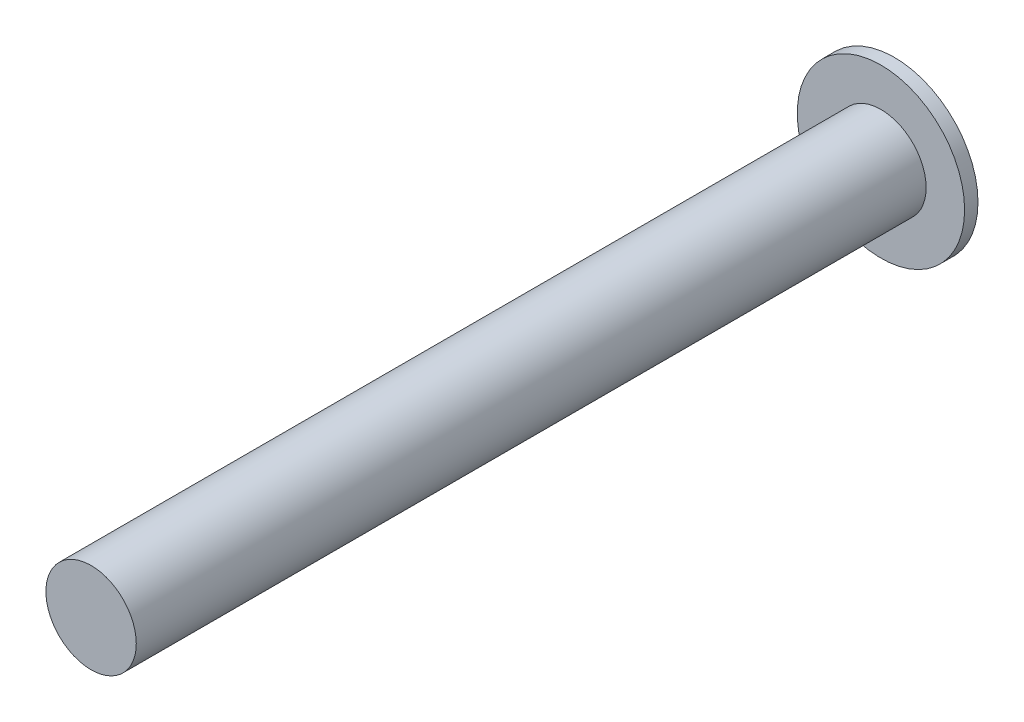
ISO-10303-21;
HEADER;
FILE_DESCRIPTION(('STEP AP214'),'2;1');
FILE_NAME('part.step','',(''),(''),'','','');
FILE_SCHEMA(('AUTOMOTIVE_DESIGN { 1 0 10303 214 1 1 1 1 }'));
ENDSEC;
DATA;
#1=APPLICATION_CONTEXT('core data for automotive mechanical design processes');
#2=APPLICATION_PROTOCOL_DEFINITION('international standard','automotive_design',2000,#1);
#3=PRODUCT_CONTEXT('',#1,'mechanical');
#4=PRODUCT('Part','Part','',(#3));
#5=PRODUCT_RELATED_PRODUCT_CATEGORY('part','',(#4));
#6=PRODUCT_DEFINITION_FORMATION('','',#4);
#7=PRODUCT_DEFINITION_CONTEXT('part definition',#1,'design');
#8=PRODUCT_DEFINITION('design','',#6,#7);
#9=PRODUCT_DEFINITION_SHAPE('','',#8);
#10=(LENGTH_UNIT() NAMED_UNIT(*) SI_UNIT(.MILLI.,.METRE.));
#11=(NAMED_UNIT(*) PLANE_ANGLE_UNIT() SI_UNIT($,.RADIAN.));
#12=(NAMED_UNIT(*) SI_UNIT($,.STERADIAN.) SOLID_ANGLE_UNIT());
#13=UNCERTAINTY_MEASURE_WITH_UNIT(LENGTH_MEASURE(1.E-05),#10,'distance_accuracy_value','');
#14=(GEOMETRIC_REPRESENTATION_CONTEXT(3) GLOBAL_UNCERTAINTY_ASSIGNED_CONTEXT((#13)) GLOBAL_UNIT_ASSIGNED_CONTEXT((#10,
#11,#12)) REPRESENTATION_CONTEXT('',''));
#15=CARTESIAN_POINT('',(0.,0.,0.));
#16=DIRECTION('',(0.,0.,1.));
#17=DIRECTION('',(1.,0.,0.));
#18=AXIS2_PLACEMENT_3D('',#15,#16,#17);
#19=CARTESIAN_POINT('',(0.,0.,2.));
#20=DIRECTION('',(0.,0.,-1.));
#21=DIRECTION('',(-1.,0.,0.));
#22=AXIS2_PLACEMENT_3D('',#19,#20,#21);
#23=CYLINDRICAL_SURFACE('',#22,12.5);
#24=CARTESIAN_POINT('',(0.,0.,2.));
#25=DIRECTION('',(0.,0.,1.));
#26=DIRECTION('',(1.,0.,0.));
#27=AXIS2_PLACEMENT_3D('',#24,#25,#26);
#28=CIRCLE('',#27,12.5);
#29=CARTESIAN_POINT('',(12.5,0.,2.));
#30=VERTEX_POINT('',#29);
#31=EDGE_CURVE('E77',#30,#30,#28,.T.);
#32=ORIENTED_EDGE('',*,*,#31,.F.);
#33=EDGE_LOOP('',(#32));
#34=FACE_BOUND('',#33,.T.);
#35=CARTESIAN_POINT('',(0.,0.,0.));
#36=DIRECTION('',(0.,0.,1.));
#37=DIRECTION('',(1.,0.,0.));
#38=AXIS2_PLACEMENT_3D('',#35,#36,#37);
#39=CIRCLE('',#38,12.5);
#40=CARTESIAN_POINT('',(12.5,0.,0.));
#41=VERTEX_POINT('',#40);
#42=EDGE_CURVE('E92',#41,#41,#39,.T.);
#43=ORIENTED_EDGE('',*,*,#42,.T.);
#44=EDGE_LOOP('',(#43));
#45=FACE_BOUND('',#44,.T.);
#46=ADVANCED_FACE('F35',(#34,#45),#23,.T.);
#47=CARTESIAN_POINT('',(0.,0.,2.));
#48=DIRECTION('',(0.,0.,1.));
#49=DIRECTION('',(1.,0.,0.));
#50=AXIS2_PLACEMENT_3D('',#47,#48,#49);
#51=PLANE('',#50);
#52=CARTESIAN_POINT('',(0.,0.,2.));
#53=DIRECTION('',(0.,0.,1.));
#54=DIRECTION('',(1.,0.,0.));
#55=AXIS2_PLACEMENT_3D('',#52,#53,#54);
#56=CIRCLE('',#55,6.75);
#57=CARTESIAN_POINT('',(6.75,0.,2.));
#58=VERTEX_POINT('',#57);
#59=EDGE_CURVE('E95',#58,#58,#56,.T.);
#60=ORIENTED_EDGE('',*,*,#59,.F.);
#61=EDGE_LOOP('',(#60));
#62=FACE_BOUND('',#61,.T.);
#63=ORIENTED_EDGE('',*,*,#31,.T.);
#64=EDGE_LOOP('',(#63));
#65=FACE_BOUND('',#64,.T.);
#66=ADVANCED_FACE('F140',(#62,#65),#51,.T.);
#67=CARTESIAN_POINT('',(0.,0.,0.));
#68=DIRECTION('',(0.,0.,1.));
#69=DIRECTION('',(1.,0.,0.));
#70=AXIS2_PLACEMENT_3D('',#67,#68,#69);
#71=PLANE('',#70);
#72=CARTESIAN_POINT('',(0.,0.,0.));
#73=DIRECTION('',(0.,0.,1.));
#74=DIRECTION('',(1.,0.,0.));
#75=AXIS2_PLACEMENT_3D('',#72,#73,#74);
#76=CIRCLE('',#75,5.75);
#77=CARTESIAN_POINT('',(5.75,0.,0.));
#78=VERTEX_POINT('',#77);
#79=EDGE_CURVE('E104',#78,#78,#76,.T.);
#80=ORIENTED_EDGE('',*,*,#79,.T.);
#81=EDGE_LOOP('',(#80));
#82=FACE_BOUND('',#81,.T.);
#83=ORIENTED_EDGE('',*,*,#42,.F.);
#84=EDGE_LOOP('',(#83));
#85=FACE_BOUND('',#84,.T.);
#86=ADVANCED_FACE('F145',(#82,#85),#71,.F.);
#87=CARTESIAN_POINT('',(0.,0.,120.));
#88=DIRECTION('',(0.,0.,-1.));
#89=DIRECTION('',(-1.,0.,0.));
#90=AXIS2_PLACEMENT_3D('',#87,#88,#89);
#91=CYLINDRICAL_SURFACE('',#90,6.75);
#92=DIRECTION('',(0.,0.,-1.));
#93=VECTOR('',#92,1.);
#94=CARTESIAN_POINT('',(-2.75,-6.16441400296898,120.));
#95=LINE('',#94,#93);
#96=CARTESIAN_POINT('',(-2.75,-6.16441400296898,90.));
#97=VERTEX_POINT('',#96);
#98=CARTESIAN_POINT('',(-2.75,-6.16441400296898,9.99999999999999));
#99=VERTEX_POINT('',#98);
#100=EDGE_CURVE('E84',#97,#99,#95,.T.);
#101=ORIENTED_EDGE('',*,*,#100,.F.);
#102=CARTESIAN_POINT('',(0.,0.,90.));
#103=DIRECTION('',(0.,0.,1.));
#104=DIRECTION('',(1.,0.,0.));
#105=AXIS2_PLACEMENT_3D('',#102,#103,#104);
#106=CIRCLE('',#105,6.75);
#107=CARTESIAN_POINT('',(2.75,-6.16441400296898,90.));
#108=VERTEX_POINT('',#107);
#109=EDGE_CURVE('E112',#97,#108,#106,.T.);
#110=ORIENTED_EDGE('',*,*,#109,.T.);
#111=DIRECTION('',(0.,0.,-1.));
#112=VECTOR('',#111,1.);
#113=CARTESIAN_POINT('',(2.75,-6.16441400296898,120.));
#114=LINE('',#113,#112);
#115=CARTESIAN_POINT('',(2.75,-6.16441400296898,9.99999999999999));
#116=VERTEX_POINT('',#115);
#117=EDGE_CURVE('E110',#116,#108,#114,.F.);
#118=ORIENTED_EDGE('',*,*,#117,.F.);
#119=CARTESIAN_POINT('',(0.,0.,9.99999999999999));
#120=DIRECTION('',(0.,0.,1.));
#121=DIRECTION('',(1.,0.,0.));
#122=AXIS2_PLACEMENT_3D('',#119,#120,#121);
#123=CIRCLE('',#122,6.75);
#124=EDGE_CURVE('E115',#99,#116,#123,.T.);
#125=ORIENTED_EDGE('',*,*,#124,.F.);
#126=EDGE_LOOP('',(#101,#110,#118,#125));
#127=FACE_BOUND('',#126,.T.);
#128=ORIENTED_EDGE('',*,*,#59,.T.);
#129=EDGE_LOOP('',(#128));
#130=FACE_BOUND('',#129,.T.);
#131=CARTESIAN_POINT('',(0.,0.,120.));
#132=DIRECTION('',(0.,0.,1.));
#133=DIRECTION('',(1.,0.,0.));
#134=AXIS2_PLACEMENT_3D('',#131,#132,#133);
#135=CIRCLE('',#134,6.75);
#136=CARTESIAN_POINT('',(6.75,0.,120.));
#137=VERTEX_POINT('',#136);
#138=EDGE_CURVE('E96',#137,#137,#135,.T.);
#139=ORIENTED_EDGE('',*,*,#138,.F.);
#140=EDGE_LOOP('',(#139));
#141=FACE_BOUND('',#140,.T.);
#142=ADVANCED_FACE('F124',(#127,#130,#141),#91,.T.);
#143=CARTESIAN_POINT('',(0.,0.,120.));
#144=DIRECTION('',(0.,0.,1.));
#145=DIRECTION('',(1.,0.,0.));
#146=AXIS2_PLACEMENT_3D('',#143,#144,#145);
#147=PLANE('',#146);
#148=ORIENTED_EDGE('',*,*,#138,.T.);
#149=EDGE_LOOP('',(#148));
#150=FACE_BOUND('',#149,.T.);
#151=ADVANCED_FACE('F157',(#150),#147,.T.);
#152=CARTESIAN_POINT('',(0.,0.,115.));
#153=DIRECTION('',(0.,0.,-1.));
#154=DIRECTION('',(-1.,0.,0.));
#155=AXIS2_PLACEMENT_3D('',#152,#153,#154);
#156=CYLINDRICAL_SURFACE('',#155,5.75);
#157=CARTESIAN_POINT('',(0.,0.,90.));
#158=DIRECTION('',(0.,0.,1.));
#159=DIRECTION('',(1.,0.,0.));
#160=AXIS2_PLACEMENT_3D('',#157,#158,#159);
#161=CIRCLE('',#160,5.75);
#162=CARTESIAN_POINT('',(-2.75,-5.04975246918104,90.));
#163=VERTEX_POINT('',#162);
#164=CARTESIAN_POINT('',(2.75,-5.04975246918104,90.));
#165=VERTEX_POINT('',#164);
#166=EDGE_CURVE('E11',#163,#165,#161,.T.);
#167=ORIENTED_EDGE('',*,*,#166,.F.);
#168=DIRECTION('',(0.,0.,-1.));
#169=VECTOR('',#168,1.);
#170=CARTESIAN_POINT('',(-2.75,-5.04975246918104,115.));
#171=LINE('',#170,#169);
#172=CARTESIAN_POINT('',(-2.75,-5.04975246918104,9.99999999999999));
#173=VERTEX_POINT('',#172);
#174=EDGE_CURVE('E42',#163,#173,#171,.T.);
#175=ORIENTED_EDGE('',*,*,#174,.T.);
#176=CARTESIAN_POINT('',(0.,0.,9.99999999999999));
#177=DIRECTION('',(0.,0.,1.));
#178=DIRECTION('',(1.,0.,0.));
#179=AXIS2_PLACEMENT_3D('',#176,#177,#178);
#180=CIRCLE('',#179,5.75);
#181=CARTESIAN_POINT('',(2.75,-5.04975246918104,9.99999999999999));
#182=VERTEX_POINT('',#181);
#183=EDGE_CURVE('E71',#173,#182,#180,.T.);
#184=ORIENTED_EDGE('',*,*,#183,.T.);
#185=DIRECTION('',(0.,0.,-1.));
#186=VECTOR('',#185,1.);
#187=CARTESIAN_POINT('',(2.75,-5.04975246918104,115.));
#188=LINE('',#187,#186);
#189=EDGE_CURVE('E76',#182,#165,#188,.F.);
#190=ORIENTED_EDGE('',*,*,#189,.T.);
#191=EDGE_LOOP('',(#167,#175,#184,#190));
#192=FACE_BOUND('',#191,.T.);
#193=CARTESIAN_POINT('',(0.,0.,115.));
#194=DIRECTION('',(0.,0.,1.));
#195=DIRECTION('',(1.,0.,0.));
#196=AXIS2_PLACEMENT_3D('',#193,#194,#195);
#197=CIRCLE('',#196,5.75);
#198=CARTESIAN_POINT('',(5.75,0.,115.));
#199=VERTEX_POINT('',#198);
#200=EDGE_CURVE('E103',#199,#199,#197,.T.);
#201=ORIENTED_EDGE('',*,*,#200,.T.);
#202=EDGE_LOOP('',(#201));
#203=FACE_BOUND('',#202,.T.);
#204=ORIENTED_EDGE('',*,*,#79,.F.);
#205=EDGE_LOOP('',(#204));
#206=FACE_BOUND('',#205,.T.);
#207=ADVANCED_FACE('F88',(#192,#203,#206),#156,.F.);
#208=CARTESIAN_POINT('',(0.,0.,115.));
#209=DIRECTION('',(0.,0.,1.));
#210=DIRECTION('',(1.,0.,0.));
#211=AXIS2_PLACEMENT_3D('',#208,#209,#210);
#212=PLANE('',#211);
#213=ORIENTED_EDGE('',*,*,#200,.F.);
#214=EDGE_LOOP('',(#213));
#215=FACE_BOUND('',#214,.T.);
#216=ADVANCED_FACE('F165',(#215),#212,.F.);
#217=CARTESIAN_POINT('',(-2.75,-9.51628895519298,90.));
#218=DIRECTION('',(1.,0.,0.));
#219=DIRECTION('',(0.,0.,-1.));
#220=AXIS2_PLACEMENT_3D('',#217,#218,#219);
#221=PLANE('',#220);
#222=ORIENTED_EDGE('',*,*,#100,.T.);
#223=DIRECTION('',(0.,-1.,0.));
#224=VECTOR('',#223,1.);
#225=CARTESIAN_POINT('',(-2.75,-9.51628895519298,10.));
#226=LINE('',#225,#224);
#227=EDGE_CURVE('E49',#173,#99,#226,.T.);
#228=ORIENTED_EDGE('',*,*,#227,.F.);
#229=ORIENTED_EDGE('',*,*,#174,.F.);
#230=DIRECTION('',(0.,-1.,0.));
#231=VECTOR('',#230,1.);
#232=CARTESIAN_POINT('',(-2.75,-9.51628895519298,90.));
#233=LINE('',#232,#231);
#234=EDGE_CURVE('E118',#163,#97,#233,.T.);
#235=ORIENTED_EDGE('',*,*,#234,.T.);
#236=EDGE_LOOP('',(#222,#228,#229,#235));
#237=FACE_BOUND('',#236,.T.);
#238=ADVANCED_FACE('F80',(#237),#221,.T.);
#239=CARTESIAN_POINT('',(2.75,-9.51628895519298,90.));
#240=DIRECTION('',(-1.,0.,0.));
#241=DIRECTION('',(0.,0.,1.));
#242=AXIS2_PLACEMENT_3D('',#239,#240,#241);
#243=PLANE('',#242);
#244=ORIENTED_EDGE('',*,*,#117,.T.);
#245=DIRECTION('',(0.,1.,0.));
#246=VECTOR('',#245,1.);
#247=CARTESIAN_POINT('',(2.75,-9.51628895519298,90.));
#248=LINE('',#247,#246);
#249=EDGE_CURVE('E117',#108,#165,#248,.T.);
#250=ORIENTED_EDGE('',*,*,#249,.T.);
#251=ORIENTED_EDGE('',*,*,#189,.F.);
#252=DIRECTION('',(0.,1.,0.));
#253=VECTOR('',#252,1.);
#254=CARTESIAN_POINT('',(2.75,-9.51628895519298,10.));
#255=LINE('',#254,#253);
#256=EDGE_CURVE('E54',#116,#182,#255,.T.);
#257=ORIENTED_EDGE('',*,*,#256,.F.);
#258=EDGE_LOOP('',(#244,#250,#251,#257));
#259=FACE_BOUND('',#258,.T.);
#260=ADVANCED_FACE('F128',(#259),#243,.T.);
#261=CARTESIAN_POINT('',(0.,0.,90.));
#262=DIRECTION('',(0.,0.,1.));
#263=DIRECTION('',(1.,0.,0.));
#264=AXIS2_PLACEMENT_3D('',#261,#262,#263);
#265=PLANE('',#264);
#266=ORIENTED_EDGE('',*,*,#234,.F.);
#267=ORIENTED_EDGE('',*,*,#166,.T.);
#268=ORIENTED_EDGE('',*,*,#249,.F.);
#269=ORIENTED_EDGE('',*,*,#109,.F.);
#270=EDGE_LOOP('',(#266,#267,#268,#269));
#271=FACE_BOUND('',#270,.T.);
#272=ADVANCED_FACE('F130',(#271),#265,.F.);
#273=CARTESIAN_POINT('',(0.,0.,10.));
#274=DIRECTION('',(0.,0.,1.));
#275=DIRECTION('',(1.,0.,0.));
#276=AXIS2_PLACEMENT_3D('',#273,#274,#275);
#277=PLANE('',#276);
#278=ORIENTED_EDGE('',*,*,#124,.T.);
#279=ORIENTED_EDGE('',*,*,#256,.T.);
#280=ORIENTED_EDGE('',*,*,#183,.F.);
#281=ORIENTED_EDGE('',*,*,#227,.T.);
#282=EDGE_LOOP('',(#278,#279,#280,#281));
#283=FACE_BOUND('',#282,.T.);
#284=ADVANCED_FACE('F72',(#283),#277,.T.);
#285=CLOSED_SHELL('',(#46,#66,#86,#142,#151,#207,#216,#238,#260,#272,#284));
#286=MANIFOLD_SOLID_BREP('B2',#285);
#287=ADVANCED_BREP_SHAPE_REPRESENTATION('',(#18,#286),#14);
#288=SHAPE_DEFINITION_REPRESENTATION(#9,#287);
ENDSEC;
END-ISO-10303-21;
